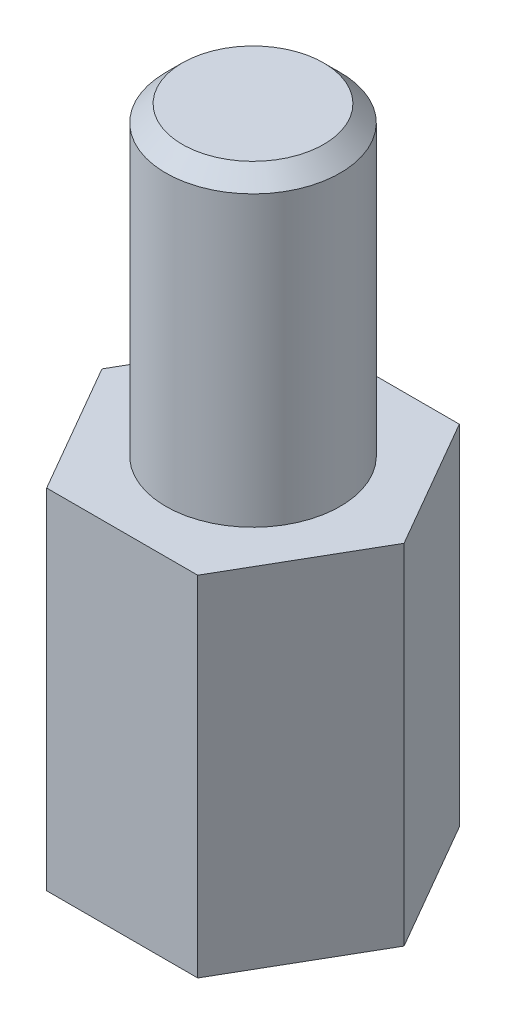
ISO-10303-21;
HEADER;
FILE_DESCRIPTION(('STEP AP214'),'2;1');
FILE_NAME('part.step','',(''),(''),'','','');
FILE_SCHEMA(('AUTOMOTIVE_DESIGN { 1 0 10303 214 1 1 1 1 }'));
ENDSEC;
DATA;
#1=APPLICATION_CONTEXT('core data for automotive mechanical design processes');
#2=APPLICATION_PROTOCOL_DEFINITION('international standard','automotive_design',2000,#1);
#3=PRODUCT_CONTEXT('',#1,'mechanical');
#4=PRODUCT('Part','Part','',(#3));
#5=PRODUCT_RELATED_PRODUCT_CATEGORY('part','',(#4));
#6=PRODUCT_DEFINITION_FORMATION('','',#4);
#7=PRODUCT_DEFINITION_CONTEXT('part definition',#1,'design');
#8=PRODUCT_DEFINITION('design','',#6,#7);
#9=PRODUCT_DEFINITION_SHAPE('','',#8);
#10=(LENGTH_UNIT() NAMED_UNIT(*) SI_UNIT(.MILLI.,.METRE.));
#11=(NAMED_UNIT(*) PLANE_ANGLE_UNIT() SI_UNIT($,.RADIAN.));
#12=(NAMED_UNIT(*) SI_UNIT($,.STERADIAN.) SOLID_ANGLE_UNIT());
#13=UNCERTAINTY_MEASURE_WITH_UNIT(LENGTH_MEASURE(1.E-05),#10,'distance_accuracy_value','');
#14=(GEOMETRIC_REPRESENTATION_CONTEXT(3) GLOBAL_UNCERTAINTY_ASSIGNED_CONTEXT((#13)) GLOBAL_UNIT_ASSIGNED_CONTEXT((#10,
#11,#12)) REPRESENTATION_CONTEXT('',''));
#15=CARTESIAN_POINT('',(0.,0.,0.));
#16=DIRECTION('',(0.,0.,1.));
#17=DIRECTION('',(1.,0.,0.));
#18=AXIS2_PLACEMENT_3D('',#15,#16,#17);
#19=CARTESIAN_POINT('',(0.,-6.00000000000002,5.99999999999591));
#20=DIRECTION('',(0.,1.,6.81565914817384E-13));
#21=DIRECTION('',(1.,0.,0.));
#22=AXIS2_PLACEMENT_3D('',#19,#20,#21);
#23=PLANE('',#22);
#24=DIRECTION('',(0.499999999999995,5.90253396585437E-13,-0.866025403784441));
#25=VECTOR('',#24,1.);
#26=CARTESIAN_POINT('',(1.7320508075689,-6.00000000000206,8.99999999999587));
#27=LINE('',#26,#25);
#28=CARTESIAN_POINT('',(1.7320508075689,-6.00000000000206,8.99999999999587));
#29=VERTEX_POINT('',#28);
#30=CARTESIAN_POINT('',(3.46410161513774,-6.00000000000002,5.99999999999591));
#31=VERTEX_POINT('',#30);
#32=EDGE_CURVE('E145',#29,#31,#27,.T.);
#33=ORIENTED_EDGE('',*,*,#32,.F.);
#34=DIRECTION('',(1.,0.,0.));
#35=VECTOR('',#34,1.);
#36=CARTESIAN_POINT('',(-1.73205080756884,-6.00000000000206,8.99999999999591));
#37=LINE('',#36,#35);
#38=CARTESIAN_POINT('',(-1.73205080756884,-6.00000000000206,8.99999999999591));
#39=VERTEX_POINT('',#38);
#40=EDGE_CURVE('E101',#39,#29,#37,.T.);
#41=ORIENTED_EDGE('',*,*,#40,.F.);
#42=DIRECTION('',(0.500000000000007,-5.90253396585432E-13,0.866025403784434));
#43=VECTOR('',#42,1.);
#44=CARTESIAN_POINT('',(-3.46410161513774,-6.00000000000002,5.99999999999593));
#45=LINE('',#44,#43);
#46=CARTESIAN_POINT('',(-3.46410161513774,-6.00000000000002,5.99999999999593));
#47=VERTEX_POINT('',#46);
#48=EDGE_CURVE('E95',#47,#39,#45,.T.);
#49=ORIENTED_EDGE('',*,*,#48,.F.);
#50=DIRECTION('',(-0.499999999999995,-5.90253396585437E-13,0.866025403784441));
#51=VECTOR('',#50,1.);
#52=CARTESIAN_POINT('',(-1.73205080756888,-5.99999999999797,2.99999999999593));
#53=LINE('',#52,#51);
#54=CARTESIAN_POINT('',(-1.73205080756888,-5.99999999999797,2.99999999999593));
#55=VERTEX_POINT('',#54);
#56=EDGE_CURVE('E132',#55,#47,#53,.T.);
#57=ORIENTED_EDGE('',*,*,#56,.F.);
#58=DIRECTION('',(-1.,0.,0.));
#59=VECTOR('',#58,1.);
#60=CARTESIAN_POINT('',(1.73205080756886,-5.99999999999797,2.99999999999592));
#61=LINE('',#60,#59);
#62=CARTESIAN_POINT('',(1.73205080756886,-5.99999999999797,2.99999999999592));
#63=VERTEX_POINT('',#62);
#64=EDGE_CURVE('E153',#63,#55,#61,.T.);
#65=ORIENTED_EDGE('',*,*,#64,.F.);
#66=DIRECTION('',(-0.500000000000001,5.90253396585434E-13,-0.866025403784438));
#67=VECTOR('',#66,1.);
#68=CARTESIAN_POINT('',(3.46410161513774,-6.00000000000002,5.99999999999591));
#69=LINE('',#68,#67);
#70=EDGE_CURVE('E149',#31,#63,#69,.T.);
#71=ORIENTED_EDGE('',*,*,#70,.F.);
#72=EDGE_LOOP('',(#33,#41,#49,#57,#65,#71));
#73=FACE_BOUND('',#72,.T.);
#74=CARTESIAN_POINT('',(0.,-6.00000000000002,5.99999999999591));
#75=DIRECTION('',(0.,-1.,-6.81565914817384E-13));
#76=DIRECTION('',(-1.,0.,0.));
#77=AXIS2_PLACEMENT_3D('',#74,#75,#76);
#78=CIRCLE('',#77,2.025);
#79=CARTESIAN_POINT('',(-2.025,-6.00000000000002,5.99999999999591));
#80=VERTEX_POINT('',#79);
#81=EDGE_CURVE('E237',#80,#80,#78,.T.);
#82=ORIENTED_EDGE('',*,*,#81,.F.);
#83=EDGE_LOOP('',(#82));
#84=FACE_BOUND('',#83,.T.);
#85=ADVANCED_FACE('F53',(#73,#84),#23,.F.);
#86=CARTESIAN_POINT('',(1.7320508075689,1.99999999999794,9.00000000000132));
#87=DIRECTION('',(-0.866025403784441,3.40782957408688E-13,-0.499999999999995));
#88=DIRECTION('',(-0.499999999999995,-5.90253396585437E-13,0.866025403784441));
#89=AXIS2_PLACEMENT_3D('',#86,#87,#88);
#90=PLANE('',#89);
#91=ORIENTED_EDGE('',*,*,#32,.T.);
#92=DIRECTION('',(0.,-1.,-6.81565914817384E-13));
#93=VECTOR('',#92,1.);
#94=CARTESIAN_POINT('',(3.46410161513774,1.99999999999998,6.00000000000136));
#95=LINE('',#94,#93);
#96=CARTESIAN_POINT('',(3.46410161513774,1.99999999999998,6.00000000000136));
#97=VERTEX_POINT('',#96);
#98=EDGE_CURVE('E11',#97,#31,#95,.T.);
#99=ORIENTED_EDGE('',*,*,#98,.F.);
#100=DIRECTION('',(0.499999999999995,5.90253396585437E-13,-0.866025403784441));
#101=VECTOR('',#100,1.);
#102=CARTESIAN_POINT('',(1.7320508075689,1.99999999999794,9.00000000000132));
#103=LINE('',#102,#101);
#104=CARTESIAN_POINT('',(1.7320508075689,1.99999999999794,9.00000000000132));
#105=VERTEX_POINT('',#104);
#106=EDGE_CURVE('E162',#105,#97,#103,.T.);
#107=ORIENTED_EDGE('',*,*,#106,.F.);
#108=DIRECTION('',(0.,-1.,-6.81565914817384E-13));
#109=VECTOR('',#108,1.);
#110=CARTESIAN_POINT('',(1.7320508075689,1.99999999999794,9.00000000000132));
#111=LINE('',#110,#109);
#112=EDGE_CURVE('E141',#105,#29,#111,.T.);
#113=ORIENTED_EDGE('',*,*,#112,.T.);
#114=EDGE_LOOP('',(#91,#99,#107,#113));
#115=FACE_BOUND('',#114,.T.);
#116=ADVANCED_FACE('F55',(#115),#90,.F.);
#117=CARTESIAN_POINT('',(3.46410161513774,1.99999999999998,6.00000000000136));
#118=DIRECTION('',(-0.866025403784438,-3.40782957408693E-13,0.500000000000001));
#119=DIRECTION('',(0.500000000000001,-5.90253396585434E-13,0.866025403784438));
#120=AXIS2_PLACEMENT_3D('',#117,#118,#119);
#121=PLANE('',#120);
#122=ORIENTED_EDGE('',*,*,#70,.T.);
#123=DIRECTION('',(0.,-1.,-6.81565914817384E-13));
#124=VECTOR('',#123,1.);
#125=CARTESIAN_POINT('',(1.73205080756886,2.00000000000203,3.00000000000137));
#126=LINE('',#125,#124);
#127=CARTESIAN_POINT('',(1.73205080756886,2.00000000000203,3.00000000000137));
#128=VERTEX_POINT('',#127);
#129=EDGE_CURVE('E63',#128,#63,#126,.T.);
#130=ORIENTED_EDGE('',*,*,#129,.F.);
#131=DIRECTION('',(-0.500000000000001,5.90253396585434E-13,-0.866025403784438));
#132=VECTOR('',#131,1.);
#133=CARTESIAN_POINT('',(3.46410161513774,1.99999999999998,6.00000000000136));
#134=LINE('',#133,#132);
#135=EDGE_CURVE('E109',#97,#128,#134,.T.);
#136=ORIENTED_EDGE('',*,*,#135,.F.);
#137=ORIENTED_EDGE('',*,*,#98,.T.);
#138=EDGE_LOOP('',(#122,#130,#136,#137));
#139=FACE_BOUND('',#138,.T.);
#140=ADVANCED_FACE('F195',(#139),#121,.F.);
#141=CARTESIAN_POINT('',(1.73205080756886,2.00000000000203,3.00000000000137));
#142=DIRECTION('',(0.,-6.81565914817384E-13,1.));
#143=DIRECTION('',(1.,0.,0.));
#144=AXIS2_PLACEMENT_3D('',#141,#142,#143);
#145=PLANE('',#144);
#146=ORIENTED_EDGE('',*,*,#64,.T.);
#147=DIRECTION('',(0.,-1.,-6.81565914817384E-13));
#148=VECTOR('',#147,1.);
#149=CARTESIAN_POINT('',(-1.73205080756888,2.00000000000203,3.00000000000138));
#150=LINE('',#149,#148);
#151=CARTESIAN_POINT('',(-1.73205080756888,2.00000000000203,3.00000000000138));
#152=VERTEX_POINT('',#151);
#153=EDGE_CURVE('E134',#152,#55,#150,.T.);
#154=ORIENTED_EDGE('',*,*,#153,.F.);
#155=DIRECTION('',(-1.,0.,0.));
#156=VECTOR('',#155,1.);
#157=CARTESIAN_POINT('',(1.73205080756886,2.00000000000203,3.00000000000137));
#158=LINE('',#157,#156);
#159=EDGE_CURVE('E123',#128,#152,#158,.T.);
#160=ORIENTED_EDGE('',*,*,#159,.F.);
#161=ORIENTED_EDGE('',*,*,#129,.T.);
#162=EDGE_LOOP('',(#146,#154,#160,#161));
#163=FACE_BOUND('',#162,.T.);
#164=ADVANCED_FACE('F172',(#163),#145,.F.);
#165=CARTESIAN_POINT('',(-1.73205080756888,2.00000000000203,3.00000000000138));
#166=DIRECTION('',(0.866025403784442,-3.40782957408688E-13,0.499999999999995));
#167=DIRECTION('',(0.499999999999995,5.90253396585437E-13,-0.866025403784441));
#168=AXIS2_PLACEMENT_3D('',#165,#166,#167);
#169=PLANE('',#168);
#170=ORIENTED_EDGE('',*,*,#56,.T.);
#171=DIRECTION('',(0.,-1.,-6.81565914817384E-13));
#172=VECTOR('',#171,1.);
#173=CARTESIAN_POINT('',(-3.46410161513774,1.99999999999998,6.00000000000138));
#174=LINE('',#173,#172);
#175=CARTESIAN_POINT('',(-3.46410161513774,1.99999999999998,6.00000000000138));
#176=VERTEX_POINT('',#175);
#177=EDGE_CURVE('E129',#176,#47,#174,.T.);
#178=ORIENTED_EDGE('',*,*,#177,.F.);
#179=DIRECTION('',(-0.499999999999995,-5.90253396585437E-13,0.866025403784441));
#180=VECTOR('',#179,1.);
#181=CARTESIAN_POINT('',(-1.73205080756888,2.00000000000203,3.00000000000138));
#182=LINE('',#181,#180);
#183=EDGE_CURVE('E117',#152,#176,#182,.T.);
#184=ORIENTED_EDGE('',*,*,#183,.F.);
#185=ORIENTED_EDGE('',*,*,#153,.T.);
#186=EDGE_LOOP('',(#170,#178,#184,#185));
#187=FACE_BOUND('',#186,.T.);
#188=ADVANCED_FACE('F130',(#187),#169,.F.);
#189=CARTESIAN_POINT('',(-3.46410161513774,1.99999999999998,6.00000000000138));
#190=DIRECTION('',(0.866025403784435,3.40782957408697E-13,-0.500000000000007));
#191=DIRECTION('',(-0.500000000000007,5.90253396585432E-13,-0.866025403784434));
#192=AXIS2_PLACEMENT_3D('',#189,#190,#191);
#193=PLANE('',#192);
#194=ORIENTED_EDGE('',*,*,#48,.T.);
#195=DIRECTION('',(0.,-1.,-6.81565914817384E-13));
#196=VECTOR('',#195,1.);
#197=CARTESIAN_POINT('',(-1.73205080756884,1.99999999999794,9.00000000000136));
#198=LINE('',#197,#196);
#199=CARTESIAN_POINT('',(-1.73205080756884,1.99999999999794,9.00000000000136));
#200=VERTEX_POINT('',#199);
#201=EDGE_CURVE('E135',#200,#39,#198,.T.);
#202=ORIENTED_EDGE('',*,*,#201,.F.);
#203=DIRECTION('',(0.500000000000007,-5.90253396585432E-13,0.866025403784434));
#204=VECTOR('',#203,1.);
#205=CARTESIAN_POINT('',(-3.46410161513774,1.99999999999998,6.00000000000138));
#206=LINE('',#205,#204);
#207=EDGE_CURVE('E121',#176,#200,#206,.T.);
#208=ORIENTED_EDGE('',*,*,#207,.F.);
#209=ORIENTED_EDGE('',*,*,#177,.T.);
#210=EDGE_LOOP('',(#194,#202,#208,#209));
#211=FACE_BOUND('',#210,.T.);
#212=ADVANCED_FACE('F137',(#211),#193,.F.);
#213=CARTESIAN_POINT('',(-1.73205080756884,1.99999999999794,9.00000000000136));
#214=DIRECTION('',(0.,6.81565914817384E-13,-1.));
#215=DIRECTION('',(-1.,0.,0.));
#216=AXIS2_PLACEMENT_3D('',#213,#214,#215);
#217=PLANE('',#216);
#218=ORIENTED_EDGE('',*,*,#40,.T.);
#219=ORIENTED_EDGE('',*,*,#112,.F.);
#220=DIRECTION('',(1.,0.,0.));
#221=VECTOR('',#220,1.);
#222=CARTESIAN_POINT('',(-1.73205080756884,1.99999999999794,9.00000000000136));
#223=LINE('',#222,#221);
#224=EDGE_CURVE('E71',#200,#105,#223,.T.);
#225=ORIENTED_EDGE('',*,*,#224,.F.);
#226=ORIENTED_EDGE('',*,*,#201,.T.);
#227=EDGE_LOOP('',(#218,#219,#225,#226));
#228=FACE_BOUND('',#227,.T.);
#229=ADVANCED_FACE('F179',(#228),#217,.F.);
#230=CARTESIAN_POINT('',(0.,1.99999999999998,6.00000000000136));
#231=DIRECTION('',(0.,1.,6.81565914817384E-13));
#232=DIRECTION('',(1.,0.,0.));
#233=AXIS2_PLACEMENT_3D('',#230,#231,#232);
#234=PLANE('',#233);
#235=CARTESIAN_POINT('',(0.,1.99999999999998,6.00000000000136));
#236=DIRECTION('',(0.,-1.,-6.81565914817384E-13));
#237=DIRECTION('',(-1.,0.,0.));
#238=AXIS2_PLACEMENT_3D('',#235,#236,#237);
#239=CIRCLE('',#238,2.);
#240=CARTESIAN_POINT('',(-2.,1.99999999999998,6.00000000000136));
#241=VERTEX_POINT('',#240);
#242=EDGE_CURVE('E227',#241,#241,#239,.T.);
#243=ORIENTED_EDGE('',*,*,#242,.T.);
#244=EDGE_LOOP('',(#243));
#245=FACE_BOUND('',#244,.T.);
#246=ORIENTED_EDGE('',*,*,#106,.T.);
#247=ORIENTED_EDGE('',*,*,#135,.T.);
#248=ORIENTED_EDGE('',*,*,#159,.T.);
#249=ORIENTED_EDGE('',*,*,#183,.T.);
#250=ORIENTED_EDGE('',*,*,#207,.T.);
#251=ORIENTED_EDGE('',*,*,#224,.T.);
#252=EDGE_LOOP('',(#246,#247,#248,#249,#250,#251));
#253=FACE_BOUND('',#252,.T.);
#254=ADVANCED_FACE('F119',(#245,#253),#234,.T.);
#255=CARTESIAN_POINT('',(0.,-1.00000000000002,5.99999999999931));
#256=DIRECTION('',(0.,-1.,-6.81565914817384E-13));
#257=DIRECTION('',(-1.,0.,0.));
#258=AXIS2_PLACEMENT_3D('',#255,#256,#257);
#259=CONICAL_SURFACE('',#258,1.65,1.02974425867665);
#260=CARTESIAN_POINT('',(0.,-0.00857997860454103,5.99999999999999));
#261=VERTEX_POINT('',#260);
#262=VERTEX_LOOP('',#261);
#263=FACE_BOUND('',#262,.T.);
#264=CARTESIAN_POINT('',(0.,-1.00000000000002,5.99999999999931));
#265=DIRECTION('',(0.,-1.,-6.81565914817384E-13));
#266=DIRECTION('',(-1.,0.,0.));
#267=AXIS2_PLACEMENT_3D('',#264,#265,#266);
#268=CIRCLE('',#267,1.65);
#269=CARTESIAN_POINT('',(-1.65,-1.00000000000002,5.99999999999931));
#270=VERTEX_POINT('',#269);
#271=EDGE_CURVE('E150',#270,#270,#268,.T.);
#272=ORIENTED_EDGE('',*,*,#271,.T.);
#273=EDGE_LOOP('',(#272));
#274=FACE_BOUND('',#273,.T.);
#275=ADVANCED_FACE('F186',(#263,#274),#259,.F.);
#276=CARTESIAN_POINT('',(0.,-6.00000000000002,5.99999999999591));
#277=DIRECTION('',(0.,-1.,-6.81565914817384E-13));
#278=DIRECTION('',(-1.,0.,0.));
#279=AXIS2_PLACEMENT_3D('',#276,#277,#278);
#280=CYLINDRICAL_SURFACE('',#279,1.65);
#281=CARTESIAN_POINT('',(0.,-5.62500000000001,5.99999999999616));
#282=DIRECTION('',(0.,-1.,-6.81565914817384E-13));
#283=DIRECTION('',(-1.,0.,0.));
#284=AXIS2_PLACEMENT_3D('',#281,#282,#283);
#285=CIRCLE('',#284,1.65);
#286=CARTESIAN_POINT('',(-1.65,-5.62500000000001,5.99999999999616));
#287=VERTEX_POINT('',#286);
#288=EDGE_CURVE('E241',#287,#287,#285,.T.);
#289=CARTESIAN_POINT('',(-1.65,-1.00000000000002,5.99999999999931));
#290=CARTESIAN_POINT('',(-1.65,-1.04817708333335,5.99999999999928));
#291=CARTESIAN_POINT('',(-1.65,-1.09635416666668,5.99999999999925));
#292=CARTESIAN_POINT('',(-1.65,-1.19270833333335,5.99999999999918));
#293=CARTESIAN_POINT('',(-1.65,-1.24088541666668,5.99999999999915));
#294=CARTESIAN_POINT('',(-1.65,-1.33723958333335,5.99999999999908));
#295=CARTESIAN_POINT('',(-1.65,-1.38541666666668,5.99999999999905));
#296=CARTESIAN_POINT('',(-1.65,-1.48177083333335,5.99999999999899));
#297=CARTESIAN_POINT('',(-1.65,-1.52994791666668,5.99999999999895));
#298=CARTESIAN_POINT('',(-1.65,-1.62630208333335,5.99999999999889));
#299=CARTESIAN_POINT('',(-1.65,-1.67447916666668,5.99999999999885));
#300=CARTESIAN_POINT('',(-1.65,-1.77083333333335,5.99999999999879));
#301=CARTESIAN_POINT('',(-1.65,-1.81901041666668,5.99999999999876));
#302=CARTESIAN_POINT('',(-1.65,-1.91536458333335,5.99999999999869));
#303=CARTESIAN_POINT('',(-1.65,-1.96354166666668,5.99999999999866));
#304=CARTESIAN_POINT('',(-1.65,-2.05989583333335,5.99999999999859));
#305=CARTESIAN_POINT('',(-1.65,-2.10807291666668,5.99999999999856));
#306=CARTESIAN_POINT('',(-1.65,-2.20442708333335,5.99999999999849));
#307=CARTESIAN_POINT('',(-1.65,-2.25260416666668,5.99999999999846));
#308=CARTESIAN_POINT('',(-1.65,-2.34895833333335,5.9999999999984));
#309=CARTESIAN_POINT('',(-1.65,-2.39713541666668,5.99999999999836));
#310=CARTESIAN_POINT('',(-1.65,-2.49348958333335,5.9999999999983));
#311=CARTESIAN_POINT('',(-1.65,-2.54166666666668,5.99999999999826));
#312=CARTESIAN_POINT('',(-1.65,-2.63802083333335,5.9999999999982));
#313=CARTESIAN_POINT('',(-1.65,-2.68619791666668,5.99999999999817));
#314=CARTESIAN_POINT('',(-1.65,-2.78255208333335,5.9999999999981));
#315=CARTESIAN_POINT('',(-1.65,-2.83072916666668,5.99999999999807));
#316=CARTESIAN_POINT('',(-1.65,-2.92708333333335,5.999999999998));
#317=CARTESIAN_POINT('',(-1.65,-2.97526041666668,5.99999999999797));
#318=CARTESIAN_POINT('',(-1.65,-3.07161458333335,5.9999999999979));
#319=CARTESIAN_POINT('',(-1.65,-3.11979166666668,5.99999999999787));
#320=CARTESIAN_POINT('',(-1.65,-3.21614583333335,5.9999999999978));
#321=CARTESIAN_POINT('',(-1.65,-3.26432291666668,5.99999999999777));
#322=CARTESIAN_POINT('',(-1.65,-3.36067708333335,5.9999999999977));
#323=CARTESIAN_POINT('',(-1.65,-3.40885416666668,5.99999999999767));
#324=CARTESIAN_POINT('',(-1.65,-3.50520833333335,5.99999999999761));
#325=CARTESIAN_POINT('',(-1.65,-3.55338541666668,5.99999999999757));
#326=CARTESIAN_POINT('',(-1.65,-3.64973958333335,5.99999999999751));
#327=CARTESIAN_POINT('',(-1.65,-3.69791666666668,5.99999999999747));
#328=CARTESIAN_POINT('',(-1.65,-3.79427083333335,5.99999999999741));
#329=CARTESIAN_POINT('',(-1.65,-3.84244791666668,5.99999999999738));
#330=CARTESIAN_POINT('',(-1.65,-3.93880208333335,5.99999999999731));
#331=CARTESIAN_POINT('',(-1.65,-3.98697916666668,5.99999999999728));
#332=CARTESIAN_POINT('',(-1.65,-4.08333333333335,5.99999999999721));
#333=CARTESIAN_POINT('',(-1.65,-4.13151041666668,5.99999999999718));
#334=CARTESIAN_POINT('',(-1.65,-4.22786458333335,5.99999999999711));
#335=CARTESIAN_POINT('',(-1.65,-4.27604166666668,5.99999999999708));
#336=CARTESIAN_POINT('',(-1.65,-4.37239583333335,5.99999999999702));
#337=CARTESIAN_POINT('',(-1.65,-4.42057291666668,5.99999999999698));
#338=CARTESIAN_POINT('',(-1.65,-4.51692708333335,5.99999999999692));
#339=CARTESIAN_POINT('',(-1.65,-4.56510416666668,5.99999999999688));
#340=CARTESIAN_POINT('',(-1.65,-4.66145833333335,5.99999999999682));
#341=CARTESIAN_POINT('',(-1.65,-4.70963541666668,5.99999999999679));
#342=CARTESIAN_POINT('',(-1.65,-4.80598958333335,5.99999999999672));
#343=CARTESIAN_POINT('',(-1.65,-4.85416666666668,5.99999999999669));
#344=CARTESIAN_POINT('',(-1.65,-4.95052083333335,5.99999999999662));
#345=CARTESIAN_POINT('',(-1.65,-4.99869791666668,5.99999999999659));
#346=CARTESIAN_POINT('',(-1.65,-5.09505208333335,5.99999999999652));
#347=CARTESIAN_POINT('',(-1.65,-5.14322916666668,5.99999999999649));
#348=CARTESIAN_POINT('',(-1.65,-5.23958333333335,5.99999999999642));
#349=CARTESIAN_POINT('',(-1.65,-5.28776041666668,5.99999999999639));
#350=CARTESIAN_POINT('',(-1.65,-5.38411458333335,5.99999999999633));
#351=CARTESIAN_POINT('',(-1.65,-5.43229166666668,5.99999999999629));
#352=CARTESIAN_POINT('',(-1.65,-5.52864583333335,5.99999999999623));
#353=CARTESIAN_POINT('',(-1.65,-5.57682291666668,5.99999999999619));
#354=CARTESIAN_POINT('',(-1.65,-5.62500000000001,5.99999999999616));
#355=B_SPLINE_CURVE_WITH_KNOTS('',3,(#289,#290,#291,#292,#293,#294,#295,#296,#297,#298,#299,
#300,#301,#302,#303,#304,#305,#306,#307,#308,#309,#310,#311,#312,#313,#314,#315,#316,#317,#318,
#319,#320,#321,#322,#323,#324,#325,#326,#327,#328,#329,#330,#331,#332,#333,#334,#335,#336,#337,
#338,#339,#340,#341,#342,#343,#344,#345,#346,#347,#348,#349,#350,#351,#352,#353,#354),
.UNSPECIFIED.,.F.,.F.,(4,2,2,2,2,2,2,2,2,2,2,2,2,2,2,2,2,2,2,2,2,2,2,2,2,2,2,2,2,2,2,2,4),(0.,
0.14453125,0.2890625,0.43359375,0.578125,0.72265625,0.8671875,1.01171875,1.15625,1.30078125,
1.4453125,1.58984375,1.734375,1.87890625,2.0234375,2.16796875,2.3125,2.45703125,2.6015625,
2.74609375,2.890625,3.03515625,3.1796875,3.32421875,3.46875,3.61328125,3.7578125,3.90234375,
4.046875,4.19140625,4.3359375,4.48046875,4.625),.UNSPECIFIED.);
#356=EDGE_CURVE('BSEAM199',#270,#287,#355,.T.);
#357=ORIENTED_EDGE('',*,*,#271,.F.);
#358=ORIENTED_EDGE('',*,*,#288,.T.);
#359=ORIENTED_EDGE('',*,*,#356,.T.);
#360=ORIENTED_EDGE('',*,*,#356,.F.);
#361=EDGE_LOOP('',(#357,#359,#358,#360));
#362=FACE_BOUND('',#361,.T.);
#363=ADVANCED_FACE('F199',(#362),#280,.F.);
#364=CARTESIAN_POINT('',(0.,-6.00000000000002,5.99999999999591));
#365=DIRECTION('',(0.,-1.,-6.81565914817384E-13));
#366=DIRECTION('',(-1.,0.,0.));
#367=AXIS2_PLACEMENT_3D('',#364,#365,#366);
#368=CONICAL_SURFACE('',#367,2.025,0.785398163397446);
#369=CARTESIAN_POINT('',(-1.65,-5.62500000000001,5.99999999999616));
#370=CARTESIAN_POINT('',(-1.65390625,-5.62890625000001,5.99999999999616));
#371=CARTESIAN_POINT('',(-1.6578125,-5.63281250000001,5.99999999999616));
#372=CARTESIAN_POINT('',(-1.665625,-5.64062500000001,5.99999999999615));
#373=CARTESIAN_POINT('',(-1.66953125,-5.64453125000001,5.99999999999615));
#374=CARTESIAN_POINT('',(-1.67734375,-5.65234375000001,5.99999999999614));
#375=CARTESIAN_POINT('',(-1.68125,-5.65625000000001,5.99999999999614));
#376=CARTESIAN_POINT('',(-1.6890625,-5.66406250000001,5.99999999999614));
#377=CARTESIAN_POINT('',(-1.69296875,-5.66796875000001,5.99999999999613));
#378=CARTESIAN_POINT('',(-1.70078125,-5.67578125000001,5.99999999999613));
#379=CARTESIAN_POINT('',(-1.7046875,-5.67968750000001,5.99999999999612));
#380=CARTESIAN_POINT('',(-1.7125,-5.68750000000001,5.99999999999612));
#381=CARTESIAN_POINT('',(-1.71640625,-5.69140625000001,5.99999999999612));
#382=CARTESIAN_POINT('',(-1.72421875,-5.69921875000002,5.99999999999611));
#383=CARTESIAN_POINT('',(-1.728125,-5.70312500000001,5.99999999999611));
#384=CARTESIAN_POINT('',(-1.7359375,-5.71093750000001,5.9999999999961));
#385=CARTESIAN_POINT('',(-1.73984375,-5.71484375000002,5.9999999999961));
#386=CARTESIAN_POINT('',(-1.74765625,-5.72265625000002,5.9999999999961));
#387=CARTESIAN_POINT('',(-1.7515625,-5.72656250000001,5.99999999999609));
#388=CARTESIAN_POINT('',(-1.759375,-5.73437500000001,5.99999999999609));
#389=CARTESIAN_POINT('',(-1.76328125,-5.73828125000002,5.99999999999608));
#390=CARTESIAN_POINT('',(-1.77109375,-5.74609375000002,5.99999999999608));
#391=CARTESIAN_POINT('',(-1.775,-5.75000000000001,5.99999999999608));
#392=CARTESIAN_POINT('',(-1.7828125,-5.75781250000001,5.99999999999607));
#393=CARTESIAN_POINT('',(-1.78671875,-5.76171875000002,5.99999999999607));
#394=CARTESIAN_POINT('',(-1.79453125,-5.76953125000002,5.99999999999606));
#395=CARTESIAN_POINT('',(-1.7984375,-5.77343750000002,5.99999999999606));
#396=CARTESIAN_POINT('',(-1.80625,-5.78125000000002,5.99999999999606));
#397=CARTESIAN_POINT('',(-1.81015625,-5.78515625000002,5.99999999999605));
#398=CARTESIAN_POINT('',(-1.81796875,-5.79296875000002,5.99999999999605));
#399=CARTESIAN_POINT('',(-1.821875,-5.79687500000002,5.99999999999604));
#400=CARTESIAN_POINT('',(-1.8296875,-5.80468750000002,5.99999999999604));
#401=CARTESIAN_POINT('',(-1.83359375,-5.80859375000002,5.99999999999604));
#402=CARTESIAN_POINT('',(-1.84140625,-5.81640625000002,5.99999999999603));
#403=CARTESIAN_POINT('',(-1.8453125,-5.82031250000002,5.99999999999603));
#404=CARTESIAN_POINT('',(-1.853125,-5.82812500000002,5.99999999999602));
#405=CARTESIAN_POINT('',(-1.85703125,-5.83203125000002,5.99999999999602));
#406=CARTESIAN_POINT('',(-1.86484375,-5.83984375000002,5.99999999999602));
#407=CARTESIAN_POINT('',(-1.86875,-5.84375000000002,5.99999999999601));
#408=CARTESIAN_POINT('',(-1.8765625,-5.85156250000002,5.99999999999601));
#409=CARTESIAN_POINT('',(-1.88046875,-5.85546875000002,5.999999999996));
#410=CARTESIAN_POINT('',(-1.88828125,-5.86328125000002,5.999999999996));
#411=CARTESIAN_POINT('',(-1.8921875,-5.86718750000002,5.999999999996));
#412=CARTESIAN_POINT('',(-1.9,-5.87500000000002,5.99999999999599));
#413=CARTESIAN_POINT('',(-1.90390625,-5.87890625000002,5.99999999999599));
#414=CARTESIAN_POINT('',(-1.91171875,-5.88671875000002,5.99999999999598));
#415=CARTESIAN_POINT('',(-1.915625,-5.89062500000002,5.99999999999598));
#416=CARTESIAN_POINT('',(-1.9234375,-5.89843750000002,5.99999999999598));
#417=CARTESIAN_POINT('',(-1.92734375,-5.90234375000002,5.99999999999597));
#418=CARTESIAN_POINT('',(-1.93515625,-5.91015625000002,5.99999999999597));
#419=CARTESIAN_POINT('',(-1.9390625,-5.91406250000002,5.99999999999596));
#420=CARTESIAN_POINT('',(-1.946875,-5.92187500000002,5.99999999999596));
#421=CARTESIAN_POINT('',(-1.95078125,-5.92578125000002,5.99999999999596));
#422=CARTESIAN_POINT('',(-1.95859375,-5.93359375000002,5.99999999999595));
#423=CARTESIAN_POINT('',(-1.9625,-5.93750000000002,5.99999999999595));
#424=CARTESIAN_POINT('',(-1.9703125,-5.94531250000002,5.99999999999594));
#425=CARTESIAN_POINT('',(-1.97421875,-5.94921875000002,5.99999999999594));
#426=CARTESIAN_POINT('',(-1.98203125,-5.95703125000002,5.99999999999594));
#427=CARTESIAN_POINT('',(-1.9859375,-5.96093750000002,5.99999999999593));
#428=CARTESIAN_POINT('',(-1.99375,-5.96875000000002,5.99999999999593));
#429=CARTESIAN_POINT('',(-1.99765625,-5.97265625000002,5.99999999999592));
#430=CARTESIAN_POINT('',(-2.00546875,-5.98046875000002,5.99999999999592));
#431=CARTESIAN_POINT('',(-2.009375,-5.98437500000002,5.99999999999592));
#432=CARTESIAN_POINT('',(-2.0171875,-5.99218750000002,5.99999999999591));
#433=CARTESIAN_POINT('',(-2.02109375,-5.99609375000002,5.99999999999591));
#434=CARTESIAN_POINT('',(-2.025,-6.00000000000002,5.99999999999591));
#435=B_SPLINE_CURVE_WITH_KNOTS('',3,(#369,#370,#371,#372,#373,#374,#375,#376,#377,#378,#379,
#380,#381,#382,#383,#384,#385,#386,#387,#388,#389,#390,#391,#392,#393,#394,#395,#396,#397,#398,
#399,#400,#401,#402,#403,#404,#405,#406,#407,#408,#409,#410,#411,#412,#413,#414,#415,#416,#417,
#418,#419,#420,#421,#422,#423,#424,#425,#426,#427,#428,#429,#430,#431,#432,#433,#434),
.UNSPECIFIED.,.F.,.F.,(4,2,2,2,2,2,2,2,2,2,2,2,2,2,2,2,2,2,2,2,2,2,2,2,2,2,2,2,2,2,2,2,4),(0.,
0.0165728151840594,0.0331456303681194,0.0497184455521789,0.0662912607362389,0.0828640759202983,
0.0994368911043583,0.116009706288418,0.132582521472478,0.149155336656538,0.165728151840597,
0.182300967024657,0.198873782208717,0.215446597392777,0.232019412576836,0.248592227760896,
0.265165042944956,0.281737858129016,0.298310673313076,0.314883488497135,0.331456303681195,
0.348029118865255,0.364601934049315,0.381174749233374,0.397747564417434,0.414320379601494,
0.430893194785554,0.447466009969614,0.464038825153673,0.480611640337733,0.497184455521793,
0.513757270705853,0.530330085889913),.UNSPECIFIED.);
#436=EDGE_CURVE('BSEAM203',#287,#80,#435,.T.);
#437=ORIENTED_EDGE('',*,*,#288,.F.);
#438=ORIENTED_EDGE('',*,*,#81,.T.);
#439=ORIENTED_EDGE('',*,*,#436,.T.);
#440=ORIENTED_EDGE('',*,*,#436,.F.);
#441=EDGE_LOOP('',(#437,#439,#438,#440));
#442=FACE_BOUND('',#441,.T.);
#443=ADVANCED_FACE('F203',(#442),#368,.F.);
#444=CARTESIAN_POINT('',(1.621,8.99999999999998,6.00000000000613));
#445=DIRECTION('',(0.,1.,6.81565914817384E-13));
#446=DIRECTION('',(1.,0.,0.));
#447=AXIS2_PLACEMENT_3D('',#444,#445,#446);
#448=PLANE('',#447);
#449=CARTESIAN_POINT('',(0.,8.99999999999998,6.00000000000613));
#450=DIRECTION('',(0.,-1.,-6.81565914817384E-13));
#451=DIRECTION('',(-1.,0.,0.));
#452=AXIS2_PLACEMENT_3D('',#449,#450,#451);
#453=CIRCLE('',#452,1.621);
#454=CARTESIAN_POINT('',(-1.621,8.99999999999999,6.00000000000613));
#455=VERTEX_POINT('',#454);
#456=EDGE_CURVE('E231',#455,#455,#453,.T.);
#457=ORIENTED_EDGE('',*,*,#456,.F.);
#458=EDGE_LOOP('',(#457));
#459=FACE_BOUND('',#458,.T.);
#460=ADVANCED_FACE('F207',(#459),#448,.T.);
#461=CARTESIAN_POINT('',(0.,8.62099999999998,6.00000000000587));
#462=DIRECTION('',(0.,-1.,-6.81565914817384E-13));
#463=DIRECTION('',(-1.,0.,0.));
#464=AXIS2_PLACEMENT_3D('',#461,#462,#463);
#465=CONICAL_SURFACE('',#464,2.,0.785398163397448);
#466=CARTESIAN_POINT('',(0.,8.62099999999998,6.00000000000587));
#467=DIRECTION('',(0.,-1.,-6.81565914817384E-13));
#468=DIRECTION('',(-1.,0.,0.));
#469=AXIS2_PLACEMENT_3D('',#466,#467,#468);
#470=CIRCLE('',#469,2.);
#471=CARTESIAN_POINT('',(-2.,8.62099999999998,6.00000000000587));
#472=VERTEX_POINT('',#471);
#473=EDGE_CURVE('E224',#472,#472,#470,.T.);
#474=CARTESIAN_POINT('',(-1.621,8.99999999999999,6.00000000000613));
#475=CARTESIAN_POINT('',(-1.62494791666666,8.99605208333332,6.00000000000613));
#476=CARTESIAN_POINT('',(-1.62889583333333,8.99210416666665,6.00000000000612));
#477=CARTESIAN_POINT('',(-1.63679166666666,8.98420833333332,6.00000000000612));
#478=CARTESIAN_POINT('',(-1.64073958333333,8.98026041666665,6.00000000000612));
#479=CARTESIAN_POINT('',(-1.64863541666666,8.97236458333332,6.00000000000611));
#480=CARTESIAN_POINT('',(-1.65258333333333,8.96841666666665,6.00000000000611));
#481=CARTESIAN_POINT('',(-1.66047916666666,8.96052083333332,6.0000000000061));
#482=CARTESIAN_POINT('',(-1.66442708333333,8.95657291666665,6.0000000000061));
#483=CARTESIAN_POINT('',(-1.67232291666666,8.94867708333332,6.00000000000609));
#484=CARTESIAN_POINT('',(-1.67627083333333,8.94472916666665,6.00000000000609));
#485=CARTESIAN_POINT('',(-1.68416666666666,8.93683333333332,6.00000000000609));
#486=CARTESIAN_POINT('',(-1.68811458333333,8.93288541666665,6.00000000000608));
#487=CARTESIAN_POINT('',(-1.69601041666666,8.92498958333332,6.00000000000608));
#488=CARTESIAN_POINT('',(-1.69995833333333,8.92104166666665,6.00000000000608));
#489=CARTESIAN_POINT('',(-1.70785416666666,8.91314583333332,6.00000000000607));
#490=CARTESIAN_POINT('',(-1.71180208333333,8.90919791666665,6.00000000000607));
#491=CARTESIAN_POINT('',(-1.71969791666666,8.90130208333332,6.00000000000606));
#492=CARTESIAN_POINT('',(-1.72364583333333,8.89735416666665,6.00000000000606));
#493=CARTESIAN_POINT('',(-1.73154166666666,8.88945833333332,6.00000000000605));
#494=CARTESIAN_POINT('',(-1.73548958333333,8.88551041666665,6.00000000000605));
#495=CARTESIAN_POINT('',(-1.74338541666666,8.87761458333332,6.00000000000605));
#496=CARTESIAN_POINT('',(-1.74733333333333,8.87366666666665,6.00000000000604));
#497=CARTESIAN_POINT('',(-1.75522916666666,8.86577083333332,6.00000000000604));
#498=CARTESIAN_POINT('',(-1.75917708333333,8.86182291666665,6.00000000000604));
#499=CARTESIAN_POINT('',(-1.76707291666666,8.85392708333332,6.00000000000603));
#500=CARTESIAN_POINT('',(-1.77102083333333,8.84997916666665,6.00000000000603));
#501=CARTESIAN_POINT('',(-1.77891666666666,8.84208333333332,6.00000000000602));
#502=CARTESIAN_POINT('',(-1.78286458333333,8.83813541666665,6.00000000000602));
#503=CARTESIAN_POINT('',(-1.79076041666666,8.83023958333332,6.00000000000601));
#504=CARTESIAN_POINT('',(-1.79470833333333,8.82629166666665,6.00000000000601));
#505=CARTESIAN_POINT('',(-1.80260416666666,8.81839583333332,6.00000000000601));
#506=CARTESIAN_POINT('',(-1.80655208333333,8.81444791666665,6.000000000006));
#507=CARTESIAN_POINT('',(-1.81444791666666,8.80655208333332,6.000000000006));
#508=CARTESIAN_POINT('',(-1.81839583333333,8.80260416666665,6.000000000006));
#509=CARTESIAN_POINT('',(-1.82629166666666,8.79470833333332,6.00000000000599));
#510=CARTESIAN_POINT('',(-1.83023958333333,8.79076041666665,6.00000000000599));
#511=CARTESIAN_POINT('',(-1.83813541666666,8.78286458333332,6.00000000000598));
#512=CARTESIAN_POINT('',(-1.84208333333333,8.77891666666665,6.00000000000598));
#513=CARTESIAN_POINT('',(-1.84997916666666,8.77102083333332,6.00000000000597));
#514=CARTESIAN_POINT('',(-1.85392708333333,8.76707291666665,6.00000000000597));
#515=CARTESIAN_POINT('',(-1.86182291666666,8.75917708333332,6.00000000000597));
#516=CARTESIAN_POINT('',(-1.86577083333333,8.75522916666665,6.00000000000596));
#517=CARTESIAN_POINT('',(-1.87366666666666,8.74733333333332,6.00000000000596));
#518=CARTESIAN_POINT('',(-1.87761458333333,8.74338541666665,6.00000000000595));
#519=CARTESIAN_POINT('',(-1.88551041666666,8.73548958333332,6.00000000000595));
#520=CARTESIAN_POINT('',(-1.88945833333333,8.73154166666665,6.00000000000595));
#521=CARTESIAN_POINT('',(-1.89735416666666,8.72364583333332,6.00000000000594));
#522=CARTESIAN_POINT('',(-1.90130208333333,8.71969791666665,6.00000000000594));
#523=CARTESIAN_POINT('',(-1.90919791666666,8.71180208333332,6.00000000000593));
#524=CARTESIAN_POINT('',(-1.91314583333333,8.70785416666665,6.00000000000593));
#525=CARTESIAN_POINT('',(-1.92104166666666,8.69995833333332,6.00000000000593));
#526=CARTESIAN_POINT('',(-1.92498958333333,8.69601041666665,6.00000000000592));
#527=CARTESIAN_POINT('',(-1.93288541666666,8.68811458333332,6.00000000000592));
#528=CARTESIAN_POINT('',(-1.93683333333333,8.68416666666665,6.00000000000591));
#529=CARTESIAN_POINT('',(-1.94472916666666,8.67627083333332,6.00000000000591));
#530=CARTESIAN_POINT('',(-1.94867708333333,8.67232291666665,6.00000000000591));
#531=CARTESIAN_POINT('',(-1.95657291666666,8.66442708333332,6.0000000000059));
#532=CARTESIAN_POINT('',(-1.96052083333333,8.66047916666665,6.0000000000059));
#533=CARTESIAN_POINT('',(-1.96841666666667,8.65258333333332,6.00000000000589));
#534=CARTESIAN_POINT('',(-1.97236458333333,8.64863541666665,6.00000000000589));
#535=CARTESIAN_POINT('',(-1.98026041666666,8.64073958333332,6.00000000000589));
#536=CARTESIAN_POINT('',(-1.98420833333333,8.63679166666665,6.00000000000588));
#537=CARTESIAN_POINT('',(-1.99210416666667,8.62889583333332,6.00000000000588));
#538=CARTESIAN_POINT('',(-1.99605208333333,8.62494791666665,6.00000000000587));
#539=CARTESIAN_POINT('',(-2.,8.62099999999998,6.00000000000587));
#540=B_SPLINE_CURVE_WITH_KNOTS('',3,(#474,#475,#476,#477,#478,#479,#480,#481,#482,#483,#484,
#485,#486,#487,#488,#489,#490,#491,#492,#493,#494,#495,#496,#497,#498,#499,#500,#501,#502,#503,
#504,#505,#506,#507,#508,#509,#510,#511,#512,#513,#514,#515,#516,#517,#518,#519,#520,#521,#522,
#523,#524,#525,#526,#527,#528,#529,#530,#531,#532,#533,#534,#535,#536,#537,#538,#539),
.UNSPECIFIED.,.F.,.F.,(4,2,2,2,2,2,2,2,2,2,2,2,2,2,2,2,2,2,2,2,2,2,2,2,2,2,2,2,2,2,2,2,4),(0.,
0.0167495918793567,0.0334991837587134,0.0502487756380702,0.0669983675174258,0.0837479593967825,
0.100497551276139,0.117247143155495,0.133996735034852,0.150746326914208,0.167495918793564,
0.184245510672921,0.200995102552278,0.217744694431633,0.23449428631099,0.251243878190346,
0.267993470069702,0.284743061949059,0.301492653828416,0.318242245707772,0.334991837587128,
0.351741429466485,0.368491021345841,0.385240613225197,0.401990205104554,0.418739796983911,
0.435489388863266,0.452238980742623,0.46898857262198,0.485738164501335,0.502487756380692,
0.519237348260049,0.535986940139406),.UNSPECIFIED.);
#541=EDGE_CURVE('BSEAM211',#455,#472,#540,.T.);
#542=ORIENTED_EDGE('',*,*,#456,.T.);
#543=ORIENTED_EDGE('',*,*,#473,.F.);
#544=ORIENTED_EDGE('',*,*,#541,.T.);
#545=ORIENTED_EDGE('',*,*,#541,.F.);
#546=EDGE_LOOP('',(#542,#544,#543,#545));
#547=FACE_BOUND('',#546,.T.);
#548=ADVANCED_FACE('F211',(#547),#465,.T.);
#549=CARTESIAN_POINT('',(0.,1.99999999999998,6.00000000000136));
#550=DIRECTION('',(0.,-1.,-6.81565914817384E-13));
#551=DIRECTION('',(-1.,0.,0.));
#552=AXIS2_PLACEMENT_3D('',#549,#550,#551);
#553=CYLINDRICAL_SURFACE('',#552,2.);
#554=CARTESIAN_POINT('',(-2.,8.62099999999998,6.00000000000587));
#555=CARTESIAN_POINT('',(-2.,8.55203124999998,6.00000000000582));
#556=CARTESIAN_POINT('',(-2.,8.48306249999998,6.00000000000578));
#557=CARTESIAN_POINT('',(-2.,8.34512499999999,6.00000000000568));
#558=CARTESIAN_POINT('',(-2.,8.27615624999998,6.00000000000564));
#559=CARTESIAN_POINT('',(-2.,8.13821874999998,6.00000000000554));
#560=CARTESIAN_POINT('',(-2.,8.06924999999998,6.0000000000055));
#561=CARTESIAN_POINT('',(-2.,7.93131249999998,6.0000000000054));
#562=CARTESIAN_POINT('',(-2.,7.86234374999998,6.00000000000535));
#563=CARTESIAN_POINT('',(-2.,7.72440624999998,6.00000000000526));
#564=CARTESIAN_POINT('',(-2.,7.65543749999998,6.00000000000521));
#565=CARTESIAN_POINT('',(-2.,7.51749999999998,6.00000000000512));
#566=CARTESIAN_POINT('',(-2.,7.44853124999998,6.00000000000507));
#567=CARTESIAN_POINT('',(-2.,7.31059374999998,6.00000000000498));
#568=CARTESIAN_POINT('',(-2.,7.24162499999998,6.00000000000493));
#569=CARTESIAN_POINT('',(-2.,7.10368749999998,6.00000000000484));
#570=CARTESIAN_POINT('',(-2.,7.03471874999998,6.00000000000479));
#571=CARTESIAN_POINT('',(-2.,6.89678124999998,6.0000000000047));
#572=CARTESIAN_POINT('',(-2.,6.82781249999998,6.00000000000465));
#573=CARTESIAN_POINT('',(-2.,6.68987499999998,6.00000000000455));
#574=CARTESIAN_POINT('',(-2.,6.62090624999998,6.00000000000451));
#575=CARTESIAN_POINT('',(-2.,6.48296874999998,6.00000000000441));
#576=CARTESIAN_POINT('',(-2.,6.41399999999998,6.00000000000437));
#577=CARTESIAN_POINT('',(-2.,6.27606249999998,6.00000000000427));
#578=CARTESIAN_POINT('',(-2.,6.20709374999998,6.00000000000423));
#579=CARTESIAN_POINT('',(-2.,6.06915624999998,6.00000000000413));
#580=CARTESIAN_POINT('',(-2.,6.00018749999998,6.00000000000408));
#581=CARTESIAN_POINT('',(-2.,5.86224999999998,6.00000000000399));
#582=CARTESIAN_POINT('',(-2.,5.79328124999998,6.00000000000394));
#583=CARTESIAN_POINT('',(-2.,5.65534374999998,6.00000000000385));
#584=CARTESIAN_POINT('',(-2.,5.58637499999998,6.0000000000038));
#585=CARTESIAN_POINT('',(-2.,5.44843749999998,6.00000000000371));
#586=CARTESIAN_POINT('',(-2.,5.37946874999998,6.00000000000366));
#587=CARTESIAN_POINT('',(-2.,5.24153124999998,6.00000000000357));
#588=CARTESIAN_POINT('',(-2.,5.17256249999998,6.00000000000352));
#589=CARTESIAN_POINT('',(-2.,5.03462499999998,6.00000000000343));
#590=CARTESIAN_POINT('',(-2.,4.96565624999998,6.00000000000338));
#591=CARTESIAN_POINT('',(-2.,4.82771874999998,6.00000000000329));
#592=CARTESIAN_POINT('',(-2.,4.75874999999998,6.00000000000324));
#593=CARTESIAN_POINT('',(-2.,4.62081249999998,6.00000000000315));
#594=CARTESIAN_POINT('',(-2.,4.55184374999998,6.0000000000031));
#595=CARTESIAN_POINT('',(-2.,4.41390624999998,6.000000000003));
#596=CARTESIAN_POINT('',(-2.,4.34493749999998,6.00000000000296));
#597=CARTESIAN_POINT('',(-2.,4.20699999999998,6.00000000000286));
#598=CARTESIAN_POINT('',(-2.,4.13803124999998,6.00000000000282));
#599=CARTESIAN_POINT('',(-2.,4.00009374999998,6.00000000000272));
#600=CARTESIAN_POINT('',(-2.,3.93112499999998,6.00000000000267));
#601=CARTESIAN_POINT('',(-2.,3.79318749999998,6.00000000000258));
#602=CARTESIAN_POINT('',(-2.,3.72421874999998,6.00000000000253));
#603=CARTESIAN_POINT('',(-2.,3.58628124999998,6.00000000000244));
#604=CARTESIAN_POINT('',(-2.,3.51731249999998,6.00000000000239));
#605=CARTESIAN_POINT('',(-2.,3.37937499999998,6.0000000000023));
#606=CARTESIAN_POINT('',(-2.,3.31040624999998,6.00000000000225));
#607=CARTESIAN_POINT('',(-2.,3.17246874999998,6.00000000000216));
#608=CARTESIAN_POINT('',(-2.,3.10349999999998,6.00000000000211));
#609=CARTESIAN_POINT('',(-2.,2.96556249999998,6.00000000000202));
#610=CARTESIAN_POINT('',(-2.,2.89659374999998,6.00000000000197));
#611=CARTESIAN_POINT('',(-2.,2.75865624999998,6.00000000000187));
#612=CARTESIAN_POINT('',(-2.,2.68968749999998,6.00000000000183));
#613=CARTESIAN_POINT('',(-2.,2.55174999999998,6.00000000000173));
#614=CARTESIAN_POINT('',(-2.,2.48278124999998,6.00000000000169));
#615=CARTESIAN_POINT('',(-2.,2.34484374999998,6.00000000000159));
#616=CARTESIAN_POINT('',(-2.,2.27587499999998,6.00000000000155));
#617=CARTESIAN_POINT('',(-2.,2.13793749999998,6.00000000000145));
#618=CARTESIAN_POINT('',(-2.,2.06896874999998,6.00000000000141));
#619=CARTESIAN_POINT('',(-2.,1.99999999999998,6.00000000000136));
#620=B_SPLINE_CURVE_WITH_KNOTS('',3,(#554,#555,#556,#557,#558,#559,#560,#561,#562,#563,#564,
#565,#566,#567,#568,#569,#570,#571,#572,#573,#574,#575,#576,#577,#578,#579,#580,#581,#582,#583,
#584,#585,#586,#587,#588,#589,#590,#591,#592,#593,#594,#595,#596,#597,#598,#599,#600,#601,#602,
#603,#604,#605,#606,#607,#608,#609,#610,#611,#612,#613,#614,#615,#616,#617,#618,#619),
.UNSPECIFIED.,.F.,.F.,(4,2,2,2,2,2,2,2,2,2,2,2,2,2,2,2,2,2,2,2,2,2,2,2,2,2,2,2,2,2,2,2,4),(0.,
0.20690625,0.413812500000001,0.620718750000001,0.827625,1.03453125,1.2414375,1.44834375,1.65525,
1.86215625,2.0690625,2.27596875,2.482875,2.68978125,2.8966875,3.10359375,3.3105,3.51740625,
3.7243125,3.93121875,4.138125,4.34503125,4.5519375,4.75884375,4.96575,5.17265625,5.3795625,
5.58646875,5.793375,6.00028125,6.2071875,6.41409375,6.621),.UNSPECIFIED.);
#621=EDGE_CURVE('BSEAM215',#472,#241,#620,.T.);
#622=ORIENTED_EDGE('',*,*,#473,.T.);
#623=ORIENTED_EDGE('',*,*,#242,.F.);
#624=ORIENTED_EDGE('',*,*,#621,.T.);
#625=ORIENTED_EDGE('',*,*,#621,.F.);
#626=EDGE_LOOP('',(#622,#624,#623,#625));
#627=FACE_BOUND('',#626,.T.);
#628=ADVANCED_FACE('F215',(#627),#553,.T.);
#629=CLOSED_SHELL('',(#85,#116,#140,#164,#188,#212,#229,#254,#275,#363,#443,#460,#548,#628));
#630=MANIFOLD_SOLID_BREP('B2',#629);
#631=ADVANCED_BREP_SHAPE_REPRESENTATION('',(#18,#630),#14);
#632=SHAPE_DEFINITION_REPRESENTATION(#9,#631);
ENDSEC;
END-ISO-10303-21;
